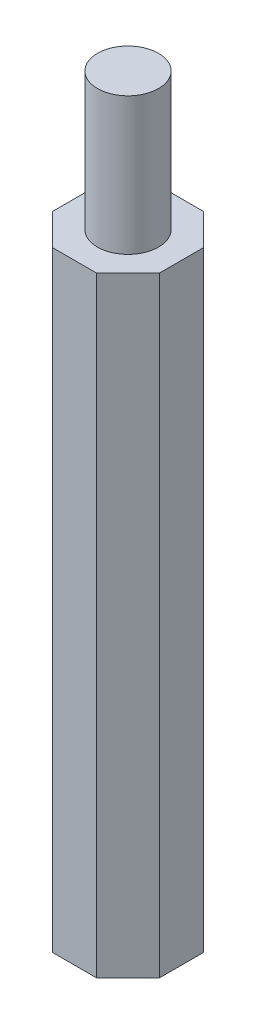
ISO-10303-21;
HEADER;
FILE_DESCRIPTION(('STEP AP214'),'2;1');
FILE_NAME('part.step','',(''),(''),'','','');
FILE_SCHEMA(('AUTOMOTIVE_DESIGN { 1 0 10303 214 1 1 1 1 }'));
ENDSEC;
DATA;
#1=APPLICATION_CONTEXT('core data for automotive mechanical design processes');
#2=APPLICATION_PROTOCOL_DEFINITION('international standard','automotive_design',2000,#1);
#3=PRODUCT_CONTEXT('',#1,'mechanical');
#4=PRODUCT('Part','Part','',(#3));
#5=PRODUCT_RELATED_PRODUCT_CATEGORY('part','',(#4));
#6=PRODUCT_DEFINITION_FORMATION('','',#4);
#7=PRODUCT_DEFINITION_CONTEXT('part definition',#1,'design');
#8=PRODUCT_DEFINITION('design','',#6,#7);
#9=PRODUCT_DEFINITION_SHAPE('','',#8);
#10=(LENGTH_UNIT() NAMED_UNIT(*) SI_UNIT(.MILLI.,.METRE.));
#11=(NAMED_UNIT(*) PLANE_ANGLE_UNIT() SI_UNIT($,.RADIAN.));
#12=(NAMED_UNIT(*) SI_UNIT($,.STERADIAN.) SOLID_ANGLE_UNIT());
#13=UNCERTAINTY_MEASURE_WITH_UNIT(LENGTH_MEASURE(1.E-05),#10,'distance_accuracy_value','');
#14=(GEOMETRIC_REPRESENTATION_CONTEXT(3) GLOBAL_UNCERTAINTY_ASSIGNED_CONTEXT((#13)) GLOBAL_UNIT_ASSIGNED_CONTEXT((#10,
#11,#12)) REPRESENTATION_CONTEXT('',''));
#15=CARTESIAN_POINT('',(0.,0.,0.));
#16=DIRECTION('',(0.,0.,1.));
#17=DIRECTION('',(1.,0.,0.));
#18=AXIS2_PLACEMENT_3D('',#15,#16,#17);
#19=CARTESIAN_POINT('',(-4.94974746830584,20.,0.));
#20=DIRECTION('',(0.,1.,0.));
#21=DIRECTION('',(0.,0.,1.));
#22=AXIS2_PLACEMENT_3D('',#19,#20,#21);
#23=PLANE('',#22);
#24=DIRECTION('',(-0.707106781186548,0.,0.707106781186547));
#25=VECTOR('',#24,1.);
#26=CARTESIAN_POINT('',(-3.5,20.,-1.44974746830583));
#27=LINE('',#26,#25);
#28=CARTESIAN_POINT('',(-1.44974746830583,20.,-3.5));
#29=VERTEX_POINT('',#28);
#30=CARTESIAN_POINT('',(-3.5,20.,-1.44974746830583));
#31=VERTEX_POINT('',#30);
#32=EDGE_CURVE('E143',#29,#31,#27,.T.);
#33=ORIENTED_EDGE('',*,*,#32,.T.);
#34=DIRECTION('',(0.,0.,1.));
#35=VECTOR('',#34,1.);
#36=CARTESIAN_POINT('',(-3.5,20.,1.44974746830583));
#37=LINE('',#36,#35);
#38=CARTESIAN_POINT('',(-3.5,20.,1.44974746830583));
#39=VERTEX_POINT('',#38);
#40=EDGE_CURVE('E91',#31,#39,#37,.T.);
#41=ORIENTED_EDGE('',*,*,#40,.T.);
#42=DIRECTION('',(0.707106781186548,0.,0.707106781186548));
#43=VECTOR('',#42,1.);
#44=CARTESIAN_POINT('',(-1.44974746830583,20.,3.5));
#45=LINE('',#44,#43);
#46=CARTESIAN_POINT('',(-1.44974746830583,20.,3.5));
#47=VERTEX_POINT('',#46);
#48=EDGE_CURVE('E158',#39,#47,#45,.T.);
#49=ORIENTED_EDGE('',*,*,#48,.T.);
#50=DIRECTION('',(1.,0.,0.));
#51=VECTOR('',#50,1.);
#52=CARTESIAN_POINT('',(1.44974746830583,20.,3.5));
#53=LINE('',#52,#51);
#54=CARTESIAN_POINT('',(1.44974746830583,20.,3.5));
#55=VERTEX_POINT('',#54);
#56=EDGE_CURVE('E170',#47,#55,#53,.T.);
#57=ORIENTED_EDGE('',*,*,#56,.T.);
#58=DIRECTION('',(0.707106781186548,0.,-0.707106781186547));
#59=VECTOR('',#58,1.);
#60=CARTESIAN_POINT('',(3.5,20.,1.44974746830583));
#61=LINE('',#60,#59);
#62=CARTESIAN_POINT('',(3.5,20.,1.44974746830583));
#63=VERTEX_POINT('',#62);
#64=EDGE_CURVE('E110',#55,#63,#61,.T.);
#65=ORIENTED_EDGE('',*,*,#64,.T.);
#66=DIRECTION('',(0.,0.,-1.));
#67=VECTOR('',#66,1.);
#68=CARTESIAN_POINT('',(3.5,20.,-1.44974746830583));
#69=LINE('',#68,#67);
#70=CARTESIAN_POINT('',(3.5,20.,-1.44974746830583));
#71=VERTEX_POINT('',#70);
#72=EDGE_CURVE('E104',#63,#71,#69,.T.);
#73=ORIENTED_EDGE('',*,*,#72,.T.);
#74=DIRECTION('',(-0.707106781186548,0.,-0.707106781186547));
#75=VECTOR('',#74,1.);
#76=CARTESIAN_POINT('',(1.44974746830583,20.,-3.5));
#77=LINE('',#76,#75);
#78=CARTESIAN_POINT('',(1.44974746830583,20.,-3.5));
#79=VERTEX_POINT('',#78);
#80=EDGE_CURVE('E108',#71,#79,#77,.T.);
#81=ORIENTED_EDGE('',*,*,#80,.T.);
#82=DIRECTION('',(-1.,0.,0.));
#83=VECTOR('',#82,1.);
#84=CARTESIAN_POINT('',(-1.44974746830583,20.,-3.5));
#85=LINE('',#84,#83);
#86=EDGE_CURVE('E48',#79,#29,#85,.T.);
#87=ORIENTED_EDGE('',*,*,#86,.T.);
#88=EDGE_LOOP('',(#33,#41,#49,#57,#65,#73,#81,#87));
#89=FACE_BOUND('',#88,.T.);
#90=CARTESIAN_POINT('',(0.,20.,0.));
#91=DIRECTION('',(0.,1.,0.));
#92=DIRECTION('',(0.,0.,1.));
#93=AXIS2_PLACEMENT_3D('',#90,#91,#92);
#94=CIRCLE('',#93,2.);
#95=CARTESIAN_POINT('',(0.,20.,2.));
#96=VERTEX_POINT('',#95);
#97=EDGE_CURVE('E176',#96,#96,#94,.T.);
#98=ORIENTED_EDGE('',*,*,#97,.F.);
#99=EDGE_LOOP('',(#98));
#100=FACE_BOUND('',#99,.T.);
#101=ADVANCED_FACE('F31',(#89,#100),#23,.T.);
#102=CARTESIAN_POINT('',(-3.5,20.,-1.44974746830583));
#103=DIRECTION('',(0.707106781186547,0.,0.707106781186548));
#104=DIRECTION('',(0.707106781186548,0.,-0.707106781186547));
#105=AXIS2_PLACEMENT_3D('',#102,#103,#104);
#106=PLANE('',#105);
#107=DIRECTION('',(-0.707106781186548,0.,0.707106781186547));
#108=VECTOR('',#107,1.);
#109=CARTESIAN_POINT('',(-3.5,-20.,-1.44974746830583));
#110=LINE('',#109,#108);
#111=CARTESIAN_POINT('',(-1.44974746830583,-20.,-3.5));
#112=VERTEX_POINT('',#111);
#113=CARTESIAN_POINT('',(-3.5,-20.,-1.44974746830583));
#114=VERTEX_POINT('',#113);
#115=EDGE_CURVE('E128',#112,#114,#110,.T.);
#116=ORIENTED_EDGE('',*,*,#115,.T.);
#117=DIRECTION('',(0.,-1.,0.));
#118=VECTOR('',#117,1.);
#119=CARTESIAN_POINT('',(-3.5,20.,-1.44974746830583));
#120=LINE('',#119,#118);
#121=EDGE_CURVE('E11',#31,#114,#120,.T.);
#122=ORIENTED_EDGE('',*,*,#121,.F.);
#123=ORIENTED_EDGE('',*,*,#32,.F.);
#124=DIRECTION('',(0.,-1.,0.));
#125=VECTOR('',#124,1.);
#126=CARTESIAN_POINT('',(-1.44974746830583,20.,-3.5));
#127=LINE('',#126,#125);
#128=EDGE_CURVE('E124',#29,#112,#127,.T.);
#129=ORIENTED_EDGE('',*,*,#128,.T.);
#130=EDGE_LOOP('',(#116,#122,#123,#129));
#131=FACE_BOUND('',#130,.T.);
#132=ADVANCED_FACE('F33',(#131),#106,.F.);
#133=CARTESIAN_POINT('',(-3.5,20.,1.44974746830583));
#134=DIRECTION('',(1.,0.,0.));
#135=DIRECTION('',(0.,0.,-1.));
#136=AXIS2_PLACEMENT_3D('',#133,#134,#135);
#137=PLANE('',#136);
#138=DIRECTION('',(0.,0.,1.));
#139=VECTOR('',#138,1.);
#140=CARTESIAN_POINT('',(-3.5,-20.,1.44974746830583));
#141=LINE('',#140,#139);
#142=CARTESIAN_POINT('',(-3.5,-20.,1.44974746830583));
#143=VERTEX_POINT('',#142);
#144=EDGE_CURVE('E131',#114,#143,#141,.T.);
#145=ORIENTED_EDGE('',*,*,#144,.T.);
#146=DIRECTION('',(0.,-1.,0.));
#147=VECTOR('',#146,1.);
#148=CARTESIAN_POINT('',(-3.5,20.,1.44974746830583));
#149=LINE('',#148,#147);
#150=EDGE_CURVE('E40',#39,#143,#149,.T.);
#151=ORIENTED_EDGE('',*,*,#150,.F.);
#152=ORIENTED_EDGE('',*,*,#40,.F.);
#153=ORIENTED_EDGE('',*,*,#121,.T.);
#154=EDGE_LOOP('',(#145,#151,#152,#153));
#155=FACE_BOUND('',#154,.T.);
#156=ADVANCED_FACE('F213',(#155),#137,.F.);
#157=CARTESIAN_POINT('',(-1.44974746830583,20.,3.5));
#158=DIRECTION('',(0.707106781186548,0.,-0.707106781186548));
#159=DIRECTION('',(-0.707106781186548,0.,-0.707106781186548));
#160=AXIS2_PLACEMENT_3D('',#157,#158,#159);
#161=PLANE('',#160);
#162=DIRECTION('',(0.707106781186548,0.,0.707106781186548));
#163=VECTOR('',#162,1.);
#164=CARTESIAN_POINT('',(-1.44974746830583,-20.,3.5));
#165=LINE('',#164,#163);
#166=CARTESIAN_POINT('',(-1.44974746830583,-20.,3.5));
#167=VERTEX_POINT('',#166);
#168=EDGE_CURVE('E134',#143,#167,#165,.T.);
#169=ORIENTED_EDGE('',*,*,#168,.T.);
#170=DIRECTION('',(0.,-1.,0.));
#171=VECTOR('',#170,1.);
#172=CARTESIAN_POINT('',(-1.44974746830583,20.,3.5));
#173=LINE('',#172,#171);
#174=EDGE_CURVE('E150',#47,#167,#173,.T.);
#175=ORIENTED_EDGE('',*,*,#174,.F.);
#176=ORIENTED_EDGE('',*,*,#48,.F.);
#177=ORIENTED_EDGE('',*,*,#150,.T.);
#178=EDGE_LOOP('',(#169,#175,#176,#177));
#179=FACE_BOUND('',#178,.T.);
#180=ADVANCED_FACE('F156',(#179),#161,.F.);
#181=CARTESIAN_POINT('',(1.44974746830583,20.,3.5));
#182=DIRECTION('',(0.,0.,-1.));
#183=DIRECTION('',(-1.,0.,0.));
#184=AXIS2_PLACEMENT_3D('',#181,#182,#183);
#185=PLANE('',#184);
#186=DIRECTION('',(1.,0.,0.));
#187=VECTOR('',#186,1.);
#188=CARTESIAN_POINT('',(1.44974746830583,-20.,3.5));
#189=LINE('',#188,#187);
#190=CARTESIAN_POINT('',(1.44974746830583,-20.,3.5));
#191=VERTEX_POINT('',#190);
#192=EDGE_CURVE('E136',#167,#191,#189,.T.);
#193=ORIENTED_EDGE('',*,*,#192,.T.);
#194=DIRECTION('',(0.,-1.,0.));
#195=VECTOR('',#194,1.);
#196=CARTESIAN_POINT('',(1.44974746830583,20.,3.5));
#197=LINE('',#196,#195);
#198=EDGE_CURVE('E147',#55,#191,#197,.T.);
#199=ORIENTED_EDGE('',*,*,#198,.F.);
#200=ORIENTED_EDGE('',*,*,#56,.F.);
#201=ORIENTED_EDGE('',*,*,#174,.T.);
#202=EDGE_LOOP('',(#193,#199,#200,#201));
#203=FACE_BOUND('',#202,.T.);
#204=ADVANCED_FACE('F166',(#203),#185,.F.);
#205=CARTESIAN_POINT('',(3.5,20.,1.44974746830583));
#206=DIRECTION('',(-0.707106781186547,0.,-0.707106781186548));
#207=DIRECTION('',(-0.707106781186548,0.,0.707106781186547));
#208=AXIS2_PLACEMENT_3D('',#205,#206,#207);
#209=PLANE('',#208);
#210=DIRECTION('',(0.707106781186548,0.,-0.707106781186547));
#211=VECTOR('',#210,1.);
#212=CARTESIAN_POINT('',(3.5,-20.,1.44974746830583));
#213=LINE('',#212,#211);
#214=CARTESIAN_POINT('',(3.5,-20.,1.44974746830583));
#215=VERTEX_POINT('',#214);
#216=EDGE_CURVE('E138',#191,#215,#213,.T.);
#217=ORIENTED_EDGE('',*,*,#216,.T.);
#218=DIRECTION('',(0.,-1.,0.));
#219=VECTOR('',#218,1.);
#220=CARTESIAN_POINT('',(3.5,20.,1.44974746830583));
#221=LINE('',#220,#219);
#222=EDGE_CURVE('E119',#63,#215,#221,.T.);
#223=ORIENTED_EDGE('',*,*,#222,.F.);
#224=ORIENTED_EDGE('',*,*,#64,.F.);
#225=ORIENTED_EDGE('',*,*,#198,.T.);
#226=EDGE_LOOP('',(#217,#223,#224,#225));
#227=FACE_BOUND('',#226,.T.);
#228=ADVANCED_FACE('F169',(#227),#209,.F.);
#229=CARTESIAN_POINT('',(3.5,20.,-1.44974746830583));
#230=DIRECTION('',(-1.,0.,0.));
#231=DIRECTION('',(0.,0.,1.));
#232=AXIS2_PLACEMENT_3D('',#229,#230,#231);
#233=PLANE('',#232);
#234=DIRECTION('',(0.,0.,-1.));
#235=VECTOR('',#234,1.);
#236=CARTESIAN_POINT('',(3.5,-20.,-1.44974746830583));
#237=LINE('',#236,#235);
#238=CARTESIAN_POINT('',(3.5,-20.,-1.44974746830583));
#239=VERTEX_POINT('',#238);
#240=EDGE_CURVE('E118',#215,#239,#237,.T.);
#241=ORIENTED_EDGE('',*,*,#240,.T.);
#242=DIRECTION('',(0.,-1.,0.));
#243=VECTOR('',#242,1.);
#244=CARTESIAN_POINT('',(3.5,20.,-1.44974746830583));
#245=LINE('',#244,#243);
#246=EDGE_CURVE('E115',#71,#239,#245,.T.);
#247=ORIENTED_EDGE('',*,*,#246,.F.);
#248=ORIENTED_EDGE('',*,*,#72,.F.);
#249=ORIENTED_EDGE('',*,*,#222,.T.);
#250=EDGE_LOOP('',(#241,#247,#248,#249));
#251=FACE_BOUND('',#250,.T.);
#252=ADVANCED_FACE('F116',(#251),#233,.F.);
#253=CARTESIAN_POINT('',(1.44974746830583,20.,-3.5));
#254=DIRECTION('',(-0.707106781186547,0.,0.707106781186548));
#255=DIRECTION('',(0.707106781186548,0.,0.707106781186547));
#256=AXIS2_PLACEMENT_3D('',#253,#254,#255);
#257=PLANE('',#256);
#258=DIRECTION('',(-0.707106781186548,0.,-0.707106781186547));
#259=VECTOR('',#258,1.);
#260=CARTESIAN_POINT('',(1.44974746830583,-20.,-3.5));
#261=LINE('',#260,#259);
#262=CARTESIAN_POINT('',(1.44974746830583,-20.,-3.5));
#263=VERTEX_POINT('',#262);
#264=EDGE_CURVE('E77',#239,#263,#261,.T.);
#265=ORIENTED_EDGE('',*,*,#264,.T.);
#266=DIRECTION('',(0.,-1.,0.));
#267=VECTOR('',#266,1.);
#268=CARTESIAN_POINT('',(1.44974746830583,20.,-3.5));
#269=LINE('',#268,#267);
#270=EDGE_CURVE('E120',#79,#263,#269,.T.);
#271=ORIENTED_EDGE('',*,*,#270,.F.);
#272=ORIENTED_EDGE('',*,*,#80,.F.);
#273=ORIENTED_EDGE('',*,*,#246,.T.);
#274=EDGE_LOOP('',(#265,#271,#272,#273));
#275=FACE_BOUND('',#274,.T.);
#276=ADVANCED_FACE('F122',(#275),#257,.F.);
#277=CARTESIAN_POINT('',(-1.44974746830583,20.,-3.5));
#278=DIRECTION('',(0.,0.,1.));
#279=DIRECTION('',(1.,0.,0.));
#280=AXIS2_PLACEMENT_3D('',#277,#278,#279);
#281=PLANE('',#280);
#282=DIRECTION('',(-1.,0.,0.));
#283=VECTOR('',#282,1.);
#284=CARTESIAN_POINT('',(-1.44974746830583,-20.,-3.5));
#285=LINE('',#284,#283);
#286=EDGE_CURVE('E83',#263,#112,#285,.T.);
#287=ORIENTED_EDGE('',*,*,#286,.T.);
#288=ORIENTED_EDGE('',*,*,#128,.F.);
#289=ORIENTED_EDGE('',*,*,#86,.F.);
#290=ORIENTED_EDGE('',*,*,#270,.T.);
#291=EDGE_LOOP('',(#287,#288,#289,#290));
#292=FACE_BOUND('',#291,.T.);
#293=ADVANCED_FACE('F199',(#292),#281,.F.);
#294=CARTESIAN_POINT('',(-4.94974746830584,-20.,0.));
#295=DIRECTION('',(0.,1.,0.));
#296=DIRECTION('',(0.,0.,1.));
#297=AXIS2_PLACEMENT_3D('',#294,#295,#296);
#298=PLANE('',#297);
#299=CARTESIAN_POINT('',(0.,-20.,0.));
#300=DIRECTION('',(0.,-1.,0.));
#301=DIRECTION('',(0.,0.,-1.));
#302=AXIS2_PLACEMENT_3D('',#299,#300,#301);
#303=CIRCLE('',#302,2.);
#304=CARTESIAN_POINT('',(0.,-20.,-2.));
#305=VERTEX_POINT('',#304);
#306=EDGE_CURVE('E182',#305,#305,#303,.T.);
#307=ORIENTED_EDGE('',*,*,#306,.F.);
#308=EDGE_LOOP('',(#307));
#309=FACE_BOUND('',#308,.T.);
#310=ORIENTED_EDGE('',*,*,#115,.F.);
#311=ORIENTED_EDGE('',*,*,#286,.F.);
#312=ORIENTED_EDGE('',*,*,#264,.F.);
#313=ORIENTED_EDGE('',*,*,#240,.F.);
#314=ORIENTED_EDGE('',*,*,#216,.F.);
#315=ORIENTED_EDGE('',*,*,#192,.F.);
#316=ORIENTED_EDGE('',*,*,#168,.F.);
#317=ORIENTED_EDGE('',*,*,#144,.F.);
#318=EDGE_LOOP('',(#310,#311,#312,#313,#314,#315,#316,#317));
#319=FACE_BOUND('',#318,.T.);
#320=ADVANCED_FACE('F162',(#309,#319),#298,.F.);
#321=CARTESIAN_POINT('',(0.,29.,0.));
#322=DIRECTION('',(0.,-1.,0.));
#323=DIRECTION('',(0.,0.,-1.));
#324=AXIS2_PLACEMENT_3D('',#321,#322,#323);
#325=CYLINDRICAL_SURFACE('',#324,2.);
#326=CARTESIAN_POINT('',(0.,29.,0.));
#327=DIRECTION('',(0.,1.,0.));
#328=DIRECTION('',(0.,0.,1.));
#329=AXIS2_PLACEMENT_3D('',#326,#327,#328);
#330=CIRCLE('',#329,2.);
#331=CARTESIAN_POINT('',(0.,29.,2.));
#332=VERTEX_POINT('',#331);
#333=EDGE_CURVE('E132',#332,#332,#330,.T.);
#334=ORIENTED_EDGE('',*,*,#333,.F.);
#335=EDGE_LOOP('',(#334));
#336=FACE_BOUND('',#335,.T.);
#337=ORIENTED_EDGE('',*,*,#97,.T.);
#338=EDGE_LOOP('',(#337));
#339=FACE_BOUND('',#338,.T.);
#340=ADVANCED_FACE('F198',(#336,#339),#325,.T.);
#341=CARTESIAN_POINT('',(0.,29.,0.));
#342=DIRECTION('',(0.,1.,0.));
#343=DIRECTION('',(0.,0.,1.));
#344=AXIS2_PLACEMENT_3D('',#341,#342,#343);
#345=PLANE('',#344);
#346=ORIENTED_EDGE('',*,*,#333,.T.);
#347=EDGE_LOOP('',(#346));
#348=FACE_BOUND('',#347,.T.);
#349=ADVANCED_FACE('F193',(#348),#345,.T.);
#350=CARTESIAN_POINT('',(0.,-11.,0.));
#351=DIRECTION('',(0.,-1.,0.));
#352=DIRECTION('',(0.,0.,-1.));
#353=AXIS2_PLACEMENT_3D('',#350,#351,#352);
#354=CYLINDRICAL_SURFACE('',#353,2.);
#355=CARTESIAN_POINT('',(0.,-11.,0.));
#356=DIRECTION('',(0.,-1.,0.));
#357=DIRECTION('',(0.,0.,-1.));
#358=AXIS2_PLACEMENT_3D('',#355,#356,#357);
#359=CIRCLE('',#358,2.);
#360=CARTESIAN_POINT('',(0.,-11.,-2.));
#361=VERTEX_POINT('',#360);
#362=EDGE_CURVE('E179',#361,#361,#359,.T.);
#363=ORIENTED_EDGE('',*,*,#362,.F.);
#364=EDGE_LOOP('',(#363));
#365=FACE_BOUND('',#364,.T.);
#366=ORIENTED_EDGE('',*,*,#306,.T.);
#367=EDGE_LOOP('',(#366));
#368=FACE_BOUND('',#367,.T.);
#369=ADVANCED_FACE('F190',(#365,#368),#354,.F.);
#370=CARTESIAN_POINT('',(0.,-11.,0.));
#371=DIRECTION('',(0.,-1.,0.));
#372=DIRECTION('',(0.,0.,-1.));
#373=AXIS2_PLACEMENT_3D('',#370,#371,#372);
#374=PLANE('',#373);
#375=ORIENTED_EDGE('',*,*,#362,.T.);
#376=EDGE_LOOP('',(#375));
#377=FACE_BOUND('',#376,.T.);
#378=ADVANCED_FACE('F188',(#377),#374,.T.);
#379=CLOSED_SHELL('',(#101,#132,#156,#180,#204,#228,#252,#276,#293,#320,#340,#349,#369,#378));
#380=MANIFOLD_SOLID_BREP('B2',#379);
#381=ADVANCED_BREP_SHAPE_REPRESENTATION('',(#18,#380),#14);
#382=SHAPE_DEFINITION_REPRESENTATION(#9,#381);
ENDSEC;
END-ISO-10303-21;
